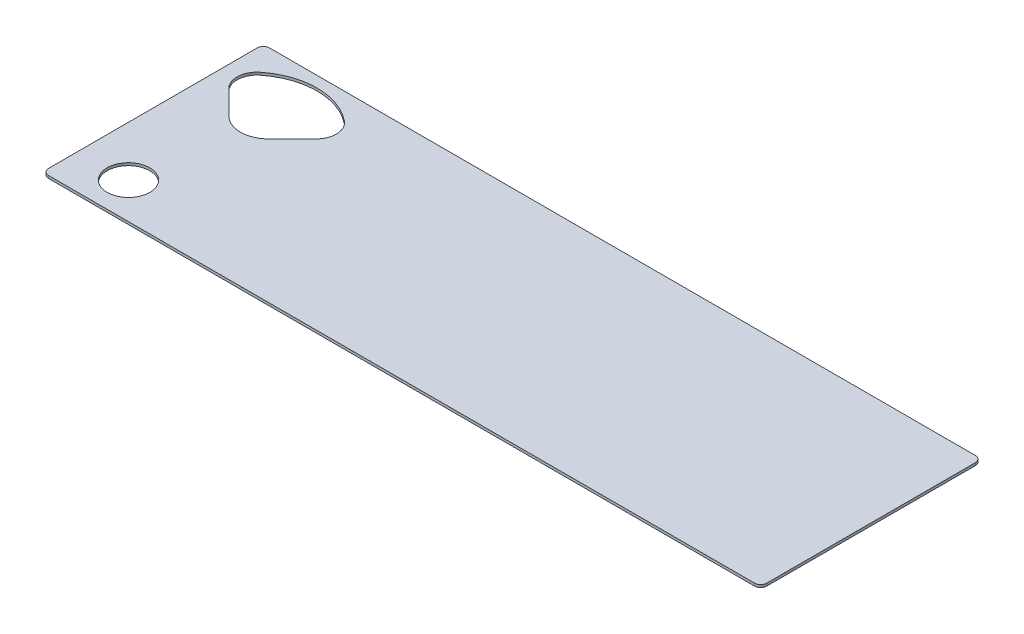
ISO-10303-21;
HEADER;
FILE_DESCRIPTION(('STEP AP214'),'2;1');
FILE_NAME('part.step','',(''),(''),'','','');
FILE_SCHEMA(('AUTOMOTIVE_DESIGN { 1 0 10303 214 1 1 1 1 }'));
ENDSEC;
DATA;
#1=APPLICATION_CONTEXT('core data for automotive mechanical design processes');
#2=APPLICATION_PROTOCOL_DEFINITION('international standard','automotive_design',2000,#1);
#3=PRODUCT_CONTEXT('',#1,'mechanical');
#4=PRODUCT('Part','Part','',(#3));
#5=PRODUCT_RELATED_PRODUCT_CATEGORY('part','',(#4));
#6=PRODUCT_DEFINITION_FORMATION('','',#4);
#7=PRODUCT_DEFINITION_CONTEXT('part definition',#1,'design');
#8=PRODUCT_DEFINITION('design','',#6,#7);
#9=PRODUCT_DEFINITION_SHAPE('','',#8);
#10=(LENGTH_UNIT() NAMED_UNIT(*) SI_UNIT(.MILLI.,.METRE.));
#11=(NAMED_UNIT(*) PLANE_ANGLE_UNIT() SI_UNIT($,.RADIAN.));
#12=(NAMED_UNIT(*) SI_UNIT($,.STERADIAN.) SOLID_ANGLE_UNIT());
#13=UNCERTAINTY_MEASURE_WITH_UNIT(LENGTH_MEASURE(1.E-05),#10,'distance_accuracy_value','');
#14=(GEOMETRIC_REPRESENTATION_CONTEXT(3) GLOBAL_UNCERTAINTY_ASSIGNED_CONTEXT((#13)) GLOBAL_UNIT_ASSIGNED_CONTEXT((#10,
#11,#12)) REPRESENTATION_CONTEXT('',''));
#15=CARTESIAN_POINT('',(0.,0.,0.));
#16=DIRECTION('',(0.,0.,1.));
#17=DIRECTION('',(1.,0.,0.));
#18=AXIS2_PLACEMENT_3D('',#15,#16,#17);
#19=CARTESIAN_POINT('',(-861.466870604861,6.35,254.406870604861));
#20=DIRECTION('',(0.,1.,0.));
#21=DIRECTION('',(-0.707106781186549,0.,0.707106781186546));
#22=AXIS2_PLACEMENT_3D('',#19,#20,#21);
#23=ELLIPSE('',#22,15.4680526775653,15.2400000000001);
#24=DIRECTION('',(0.,-1.,0.));
#25=VECTOR('',#24,1.);
#26=SURFACE_OF_LINEAR_EXTRUSION('',#23,#25);
#27=CARTESIAN_POINT('',(-861.466870604861,0.,254.406870604861));
#28=DIRECTION('',(0.,1.,0.));
#29=DIRECTION('',(-0.707106781186549,0.,0.707106781186546));
#30=AXIS2_PLACEMENT_3D('',#27,#28,#29);
#31=ELLIPSE('',#30,15.4680526775653,15.2400000000001);
#32=CARTESIAN_POINT('',(-876.821320344854,0.,254.63491699384));
#33=VERTEX_POINT('',#32);
#34=CARTESIAN_POINT('',(-861.69491699384,0.,269.761320344854));
#35=VERTEX_POINT('',#34);
#36=EDGE_CURVE('E182',#33,#35,#31,.T.);
#37=ORIENTED_EDGE('',*,*,#36,.T.);
#38=DIRECTION('',(0.,-1.,0.));
#39=VECTOR('',#38,1.);
#40=CARTESIAN_POINT('',(-861.69491699384,6.35,269.761320344854));
#41=LINE('',#40,#39);
#42=CARTESIAN_POINT('',(-861.69491699384,6.35,269.761320344854));
#43=VERTEX_POINT('',#42);
#44=EDGE_CURVE('E11',#43,#35,#41,.T.);
#45=ORIENTED_EDGE('',*,*,#44,.F.);
#46=CARTESIAN_POINT('',(-876.821320344854,6.35,254.63491699384));
#47=VERTEX_POINT('',#46);
#48=EDGE_CURVE('E189',#47,#43,#23,.T.);
#49=ORIENTED_EDGE('',*,*,#48,.F.);
#50=DIRECTION('',(0.,-1.,0.));
#51=VECTOR('',#50,1.);
#52=CARTESIAN_POINT('',(-876.821320344854,6.35,254.63491699384));
#53=LINE('',#52,#51);
#54=EDGE_CURVE('E242',#47,#33,#53,.T.);
#55=ORIENTED_EDGE('',*,*,#54,.T.);
#56=EDGE_LOOP('',(#37,#45,#49,#55));
#57=FACE_BOUND('',#56,.T.);
#58=ADVANCED_FACE('F32',(#57),#26,.F.);
#59=CARTESIAN_POINT('',(-861.69491699384,6.35,269.761320344854));
#60=DIRECTION('',(0.,0.,-1.));
#61=DIRECTION('',(-1.,0.,0.));
#62=AXIS2_PLACEMENT_3D('',#59,#60,#61);
#63=PLANE('',#62);
#64=DIRECTION('',(1.,0.,0.));
#65=VECTOR('',#64,1.);
#66=CARTESIAN_POINT('',(-861.69491699384,0.,269.761320344854));
#67=LINE('',#66,#65);
#68=CARTESIAN_POINT('',(861.69491699384,0.,269.761320344854));
#69=VERTEX_POINT('',#68);
#70=EDGE_CURVE('E216',#35,#69,#67,.T.);
#71=ORIENTED_EDGE('',*,*,#70,.T.);
#72=DIRECTION('',(0.,-1.,0.));
#73=VECTOR('',#72,1.);
#74=CARTESIAN_POINT('',(861.69491699384,6.35,269.761320344854));
#75=LINE('',#74,#73);
#76=CARTESIAN_POINT('',(861.69491699384,6.35,269.761320344854));
#77=VERTEX_POINT('',#76);
#78=EDGE_CURVE('E40',#77,#69,#75,.T.);
#79=ORIENTED_EDGE('',*,*,#78,.F.);
#80=DIRECTION('',(1.,0.,0.));
#81=VECTOR('',#80,1.);
#82=CARTESIAN_POINT('',(-861.69491699384,6.35,269.761320344854));
#83=LINE('',#82,#81);
#84=EDGE_CURVE('E193',#43,#77,#83,.T.);
#85=ORIENTED_EDGE('',*,*,#84,.F.);
#86=ORIENTED_EDGE('',*,*,#44,.T.);
#87=EDGE_LOOP('',(#71,#79,#85,#86));
#88=FACE_BOUND('',#87,.T.);
#89=ADVANCED_FACE('F206',(#88),#63,.F.);
#90=CARTESIAN_POINT('',(861.466870604861,6.35,254.406870604861));
#91=DIRECTION('',(0.,1.,0.));
#92=DIRECTION('',(0.707106781186549,0.,0.707106781186546));
#93=AXIS2_PLACEMENT_3D('',#90,#91,#92);
#94=ELLIPSE('',#93,15.4680526775653,15.24);
#95=DIRECTION('',(0.,-1.,0.));
#96=VECTOR('',#95,1.);
#97=SURFACE_OF_LINEAR_EXTRUSION('',#94,#96);
#98=CARTESIAN_POINT('',(861.466870604861,0.,254.406870604861));
#99=DIRECTION('',(0.,1.,0.));
#100=DIRECTION('',(0.707106781186549,0.,0.707106781186546));
#101=AXIS2_PLACEMENT_3D('',#98,#99,#100);
#102=ELLIPSE('',#101,15.4680526775653,15.24);
#103=CARTESIAN_POINT('',(876.821320344854,0.,254.63491699384));
#104=VERTEX_POINT('',#103);
#105=EDGE_CURVE('E223',#69,#104,#102,.T.);
#106=ORIENTED_EDGE('',*,*,#105,.T.);
#107=DIRECTION('',(0.,-1.,0.));
#108=VECTOR('',#107,1.);
#109=CARTESIAN_POINT('',(876.821320344854,6.35,254.63491699384));
#110=LINE('',#109,#108);
#111=CARTESIAN_POINT('',(876.821320344854,6.35,254.63491699384));
#112=VERTEX_POINT('',#111);
#113=EDGE_CURVE('E227',#112,#104,#110,.T.);
#114=ORIENTED_EDGE('',*,*,#113,.F.);
#115=EDGE_CURVE('E196',#77,#112,#94,.T.);
#116=ORIENTED_EDGE('',*,*,#115,.F.);
#117=ORIENTED_EDGE('',*,*,#78,.T.);
#118=EDGE_LOOP('',(#106,#114,#116,#117));
#119=FACE_BOUND('',#118,.T.);
#120=ADVANCED_FACE('F202',(#119),#97,.F.);
#121=CARTESIAN_POINT('',(876.821320344854,6.35,254.63491699384));
#122=DIRECTION('',(-1.,0.,0.));
#123=DIRECTION('',(0.,0.,1.));
#124=AXIS2_PLACEMENT_3D('',#121,#122,#123);
#125=PLANE('',#124);
#126=DIRECTION('',(0.,0.,-1.));
#127=VECTOR('',#126,1.);
#128=CARTESIAN_POINT('',(876.821320344854,0.,254.63491699384));
#129=LINE('',#128,#127);
#130=CARTESIAN_POINT('',(876.821320344854,0.,-254.63491699384));
#131=VERTEX_POINT('',#130);
#132=EDGE_CURVE('E230',#104,#131,#129,.T.);
#133=ORIENTED_EDGE('',*,*,#132,.T.);
#134=DIRECTION('',(0.,-1.,0.));
#135=VECTOR('',#134,1.);
#136=CARTESIAN_POINT('',(876.821320344854,6.35,-254.63491699384));
#137=LINE('',#136,#135);
#138=CARTESIAN_POINT('',(876.821320344854,6.35,-254.63491699384));
#139=VERTEX_POINT('',#138);
#140=EDGE_CURVE('E255',#139,#131,#137,.T.);
#141=ORIENTED_EDGE('',*,*,#140,.F.);
#142=DIRECTION('',(0.,0.,-1.));
#143=VECTOR('',#142,1.);
#144=CARTESIAN_POINT('',(876.821320344854,6.35,254.63491699384));
#145=LINE('',#144,#143);
#146=EDGE_CURVE('E199',#112,#139,#145,.T.);
#147=ORIENTED_EDGE('',*,*,#146,.F.);
#148=ORIENTED_EDGE('',*,*,#113,.T.);
#149=EDGE_LOOP('',(#133,#141,#147,#148));
#150=FACE_BOUND('',#149,.T.);
#151=ADVANCED_FACE('F205',(#150),#125,.F.);
#152=CARTESIAN_POINT('',(861.466870604861,6.35,-254.406870604861));
#153=DIRECTION('',(0.,1.,0.));
#154=DIRECTION('',(0.707106781186549,0.,-0.707106781186546));
#155=AXIS2_PLACEMENT_3D('',#152,#153,#154);
#156=ELLIPSE('',#155,15.4680526775653,15.2400000000001);
#157=DIRECTION('',(0.,-1.,0.));
#158=VECTOR('',#157,1.);
#159=SURFACE_OF_LINEAR_EXTRUSION('',#156,#158);
#160=CARTESIAN_POINT('',(861.466870604861,0.,-254.406870604861));
#161=DIRECTION('',(0.,1.,0.));
#162=DIRECTION('',(0.707106781186549,0.,-0.707106781186546));
#163=AXIS2_PLACEMENT_3D('',#160,#161,#162);
#164=ELLIPSE('',#163,15.4680526775653,15.2400000000001);
#165=CARTESIAN_POINT('',(861.69491699384,0.,-269.761320344854));
#166=VERTEX_POINT('',#165);
#167=EDGE_CURVE('E232',#131,#166,#164,.T.);
#168=ORIENTED_EDGE('',*,*,#167,.T.);
#169=DIRECTION('',(0.,-1.,0.));
#170=VECTOR('',#169,1.);
#171=CARTESIAN_POINT('',(861.69491699384,6.35,-269.761320344854));
#172=LINE('',#171,#170);
#173=CARTESIAN_POINT('',(861.69491699384,6.35,-269.761320344854));
#174=VERTEX_POINT('',#173);
#175=EDGE_CURVE('E252',#174,#166,#172,.T.);
#176=ORIENTED_EDGE('',*,*,#175,.F.);
#177=EDGE_CURVE('E263',#139,#174,#156,.T.);
#178=ORIENTED_EDGE('',*,*,#177,.F.);
#179=ORIENTED_EDGE('',*,*,#140,.T.);
#180=EDGE_LOOP('',(#168,#176,#178,#179));
#181=FACE_BOUND('',#180,.T.);
#182=ADVANCED_FACE('F270',(#181),#159,.F.);
#183=CARTESIAN_POINT('',(861.69491699384,6.35,-269.761320344854));
#184=DIRECTION('',(0.,0.,1.));
#185=DIRECTION('',(1.,0.,0.));
#186=AXIS2_PLACEMENT_3D('',#183,#184,#185);
#187=PLANE('',#186);
#188=DIRECTION('',(-1.,0.,0.));
#189=VECTOR('',#188,1.);
#190=CARTESIAN_POINT('',(861.69491699384,0.,-269.761320344854));
#191=LINE('',#190,#189);
#192=CARTESIAN_POINT('',(-861.69491699384,0.,-269.761320344854));
#193=VERTEX_POINT('',#192);
#194=EDGE_CURVE('E237',#166,#193,#191,.T.);
#195=ORIENTED_EDGE('',*,*,#194,.T.);
#196=DIRECTION('',(0.,-1.,0.));
#197=VECTOR('',#196,1.);
#198=CARTESIAN_POINT('',(-861.69491699384,6.35,-269.761320344854));
#199=LINE('',#198,#197);
#200=CARTESIAN_POINT('',(-861.69491699384,6.35,-269.761320344854));
#201=VERTEX_POINT('',#200);
#202=EDGE_CURVE('E249',#201,#193,#199,.T.);
#203=ORIENTED_EDGE('',*,*,#202,.F.);
#204=DIRECTION('',(-1.,0.,0.));
#205=VECTOR('',#204,1.);
#206=CARTESIAN_POINT('',(861.69491699384,6.35,-269.761320344854));
#207=LINE('',#206,#205);
#208=EDGE_CURVE('E264',#174,#201,#207,.T.);
#209=ORIENTED_EDGE('',*,*,#208,.F.);
#210=ORIENTED_EDGE('',*,*,#175,.T.);
#211=EDGE_LOOP('',(#195,#203,#209,#210));
#212=FACE_BOUND('',#211,.T.);
#213=ADVANCED_FACE('F273',(#212),#187,.F.);
#214=CARTESIAN_POINT('',(-861.466870604861,6.35,-254.406870604861));
#215=DIRECTION('',(0.,1.,0.));
#216=DIRECTION('',(-0.707106781186549,0.,-0.707106781186546));
#217=AXIS2_PLACEMENT_3D('',#214,#215,#216);
#218=ELLIPSE('',#217,15.4680526775653,15.24);
#219=DIRECTION('',(0.,-1.,0.));
#220=VECTOR('',#219,1.);
#221=SURFACE_OF_LINEAR_EXTRUSION('',#218,#220);
#222=CARTESIAN_POINT('',(-861.466870604861,0.,-254.406870604861));
#223=DIRECTION('',(0.,1.,0.));
#224=DIRECTION('',(-0.707106781186549,0.,-0.707106781186546));
#225=AXIS2_PLACEMENT_3D('',#222,#223,#224);
#226=ELLIPSE('',#225,15.4680526775653,15.24);
#227=CARTESIAN_POINT('',(-876.821320344854,0.,-254.63491699384));
#228=VERTEX_POINT('',#227);
#229=EDGE_CURVE('E239',#193,#228,#226,.T.);
#230=ORIENTED_EDGE('',*,*,#229,.T.);
#231=DIRECTION('',(0.,-1.,0.));
#232=VECTOR('',#231,1.);
#233=CARTESIAN_POINT('',(-876.821320344854,6.35,-254.63491699384));
#234=LINE('',#233,#232);
#235=CARTESIAN_POINT('',(-876.821320344854,6.35,-254.63491699384));
#236=VERTEX_POINT('',#235);
#237=EDGE_CURVE('E245',#236,#228,#234,.T.);
#238=ORIENTED_EDGE('',*,*,#237,.F.);
#239=EDGE_CURVE('E266',#201,#236,#218,.T.);
#240=ORIENTED_EDGE('',*,*,#239,.F.);
#241=ORIENTED_EDGE('',*,*,#202,.T.);
#242=EDGE_LOOP('',(#230,#238,#240,#241));
#243=FACE_BOUND('',#242,.T.);
#244=ADVANCED_FACE('F277',(#243),#221,.F.);
#245=CARTESIAN_POINT('',(-876.821320344854,6.35,-254.63491699384));
#246=DIRECTION('',(1.,0.,0.));
#247=DIRECTION('',(0.,0.,-1.));
#248=AXIS2_PLACEMENT_3D('',#245,#246,#247);
#249=PLANE('',#248);
#250=DIRECTION('',(0.,0.,1.));
#251=VECTOR('',#250,1.);
#252=CARTESIAN_POINT('',(-876.821320344854,0.,-254.63491699384));
#253=LINE('',#252,#251);
#254=EDGE_CURVE('E194',#228,#33,#253,.T.);
#255=ORIENTED_EDGE('',*,*,#254,.T.);
#256=ORIENTED_EDGE('',*,*,#54,.F.);
#257=DIRECTION('',(0.,0.,1.));
#258=VECTOR('',#257,1.);
#259=CARTESIAN_POINT('',(-876.821320344854,6.35,-254.63491699384));
#260=LINE('',#259,#258);
#261=EDGE_CURVE('E246',#236,#47,#260,.T.);
#262=ORIENTED_EDGE('',*,*,#261,.F.);
#263=ORIENTED_EDGE('',*,*,#237,.T.);
#264=EDGE_LOOP('',(#255,#256,#262,#263));
#265=FACE_BOUND('',#264,.T.);
#266=ADVANCED_FACE('F281',(#265),#249,.F.);
#267=CARTESIAN_POINT('',(-861.466870604861,6.35,254.406870604861));
#268=DIRECTION('',(0.,1.,0.));
#269=DIRECTION('',(0.,0.,1.));
#270=AXIS2_PLACEMENT_3D('',#267,#268,#269);
#271=PLANE('',#270);
#272=CARTESIAN_POINT('',(-754.50638834792,6.35,181.844577047281));
#273=DIRECTION('',(0.,1.,0.));
#274=DIRECTION('',(0.,0.,1.));
#275=AXIS2_PLACEMENT_3D('',#272,#273,#274);
#276=CIRCLE('',#275,52.0700000000001);
#277=CARTESIAN_POINT('',(-754.50638834792,6.35,233.914577047281));
#278=VERTEX_POINT('',#277);
#279=EDGE_CURVE('E158',#278,#278,#276,.T.);
#280=ORIENTED_EDGE('',*,*,#279,.F.);
#281=EDGE_LOOP('',(#280));
#282=FACE_BOUND('',#281,.T.);
#283=CARTESIAN_POINT('',(-719.067867535307,6.35,-124.701940777126));
#284=DIRECTION('',(0.,1.,0.));
#285=DIRECTION('',(0.,0.,1.));
#286=AXIS2_PLACEMENT_3D('',#283,#284,#285);
#287=CIRCLE('',#286,68.5871863601399);
#288=CARTESIAN_POINT('',(-767.566332113067,6.35,-76.2034761993652));
#289=VERTEX_POINT('',#288);
#290=CARTESIAN_POINT('',(-670.569402957547,6.35,-76.203476199365));
#291=VERTEX_POINT('',#290);
#292=EDGE_CURVE('E47',#289,#291,#287,.T.);
#293=ORIENTED_EDGE('',*,*,#292,.F.);
#294=DIRECTION('',(0.707106781186549,0.,0.707106781186546));
#295=VECTOR('',#294,1.);
#296=CARTESIAN_POINT('',(-825.954313112611,6.35,-134.591457198908));
#297=LINE('',#296,#295);
#298=CARTESIAN_POINT('',(-825.954313112611,6.35,-134.591457198908));
#299=VERTEX_POINT('',#298);
#300=EDGE_CURVE('E152',#299,#289,#297,.T.);
#301=ORIENTED_EDGE('',*,*,#300,.F.);
#302=CARTESIAN_POINT('',(-791.597984158582,6.35,-168.947786152938));
#303=DIRECTION('',(0.,1.,0.));
#304=DIRECTION('',(0.,0.,1.));
#305=AXIS2_PLACEMENT_3D('',#302,#303,#304);
#306=CIRCLE('',#305,48.5871863601399);
#307=CARTESIAN_POINT('',(-822.043204833292,6.35,-206.813380251845));
#308=VERTEX_POINT('',#307);
#309=EDGE_CURVE('E155',#308,#299,#306,.T.);
#310=ORIENTED_EDGE('',*,*,#309,.F.);
#311=CARTESIAN_POINT('',(-719.067867535307,6.35,-78.74));
#312=DIRECTION('',(0.,1.,0.));
#313=DIRECTION('',(0.,0.,1.));
#314=AXIS2_PLACEMENT_3D('',#311,#312,#313);
#315=CIRCLE('',#314,164.33718636014);
#316=CARTESIAN_POINT('',(-616.092530237323,6.35,-206.813380251845));
#317=VERTEX_POINT('',#316);
#318=EDGE_CURVE('E175',#317,#308,#315,.T.);
#319=ORIENTED_EDGE('',*,*,#318,.F.);
#320=CARTESIAN_POINT('',(-646.537750912032,6.35,-168.947786152938));
#321=DIRECTION('',(0.,1.,0.));
#322=DIRECTION('',(0.,0.,1.));
#323=AXIS2_PLACEMENT_3D('',#320,#321,#322);
#324=CIRCLE('',#323,48.5871863601399);
#325=CARTESIAN_POINT('',(-612.181421958003,6.35,-134.591457198909));
#326=VERTEX_POINT('',#325);
#327=EDGE_CURVE('E172',#326,#317,#324,.T.);
#328=ORIENTED_EDGE('',*,*,#327,.F.);
#329=DIRECTION('',(0.707106781186549,0.,-0.707106781186546));
#330=VECTOR('',#329,1.);
#331=CARTESIAN_POINT('',(-670.569402957547,6.35,-76.203476199365));
#332=LINE('',#331,#330);
#333=EDGE_CURVE('E169',#291,#326,#332,.T.);
#334=ORIENTED_EDGE('',*,*,#333,.F.);
#335=EDGE_LOOP('',(#293,#301,#310,#319,#328,#334));
#336=FACE_BOUND('',#335,.T.);
#337=ORIENTED_EDGE('',*,*,#48,.T.);
#338=ORIENTED_EDGE('',*,*,#84,.T.);
#339=ORIENTED_EDGE('',*,*,#115,.T.);
#340=ORIENTED_EDGE('',*,*,#146,.T.);
#341=ORIENTED_EDGE('',*,*,#177,.T.);
#342=ORIENTED_EDGE('',*,*,#208,.T.);
#343=ORIENTED_EDGE('',*,*,#239,.T.);
#344=ORIENTED_EDGE('',*,*,#261,.T.);
#345=EDGE_LOOP('',(#337,#338,#339,#340,#341,#342,#343,#344));
#346=FACE_BOUND('',#345,.T.);
#347=ADVANCED_FACE('F297',(#282,#336,#346),#271,.T.);
#348=CARTESIAN_POINT('',(-861.466870604861,0.,254.406870604861));
#349=DIRECTION('',(0.,1.,0.));
#350=DIRECTION('',(0.,0.,1.));
#351=AXIS2_PLACEMENT_3D('',#348,#349,#350);
#352=PLANE('',#351);
#353=CARTESIAN_POINT('',(-754.50638834792,0.,181.844577047281));
#354=DIRECTION('',(0.,1.,0.));
#355=DIRECTION('',(0.,0.,1.));
#356=AXIS2_PLACEMENT_3D('',#353,#354,#355);
#357=CIRCLE('',#356,52.0700000000001);
#358=CARTESIAN_POINT('',(-754.50638834792,0.,233.914577047281));
#359=VERTEX_POINT('',#358);
#360=EDGE_CURVE('E170',#359,#359,#357,.T.);
#361=ORIENTED_EDGE('',*,*,#360,.T.);
#362=EDGE_LOOP('',(#361));
#363=FACE_BOUND('',#362,.T.);
#364=DIRECTION('',(0.707106781186549,0.,0.707106781186546));
#365=VECTOR('',#364,1.);
#366=CARTESIAN_POINT('',(-825.954313112611,0.,-134.591457198908));
#367=LINE('',#366,#365);
#368=CARTESIAN_POINT('',(-825.954313112611,0.,-134.591457198908));
#369=VERTEX_POINT('',#368);
#370=CARTESIAN_POINT('',(-767.566332113067,0.,-76.2034761993652));
#371=VERTEX_POINT('',#370);
#372=EDGE_CURVE('E141',#369,#371,#367,.T.);
#373=ORIENTED_EDGE('',*,*,#372,.T.);
#374=CARTESIAN_POINT('',(-719.067867535307,0.,-124.701940777126));
#375=DIRECTION('',(0.,1.,0.));
#376=DIRECTION('',(0.,0.,1.));
#377=AXIS2_PLACEMENT_3D('',#374,#375,#376);
#378=CIRCLE('',#377,68.5871863601399);
#379=CARTESIAN_POINT('',(-670.569402957547,0.,-76.203476199365));
#380=VERTEX_POINT('',#379);
#381=EDGE_CURVE('E135',#371,#380,#378,.T.);
#382=ORIENTED_EDGE('',*,*,#381,.T.);
#383=DIRECTION('',(0.707106781186549,0.,-0.707106781186546));
#384=VECTOR('',#383,1.);
#385=CARTESIAN_POINT('',(-670.569402957547,0.,-76.203476199365));
#386=LINE('',#385,#384);
#387=CARTESIAN_POINT('',(-612.181421958003,0.,-134.591457198909));
#388=VERTEX_POINT('',#387);
#389=EDGE_CURVE('E144',#380,#388,#386,.T.);
#390=ORIENTED_EDGE('',*,*,#389,.T.);
#391=CARTESIAN_POINT('',(-646.537750912032,0.,-168.947786152938));
#392=DIRECTION('',(0.,1.,0.));
#393=DIRECTION('',(0.,0.,1.));
#394=AXIS2_PLACEMENT_3D('',#391,#392,#393);
#395=CIRCLE('',#394,48.5871863601399);
#396=CARTESIAN_POINT('',(-616.092530237323,0.,-206.813380251845));
#397=VERTEX_POINT('',#396);
#398=EDGE_CURVE('E55',#388,#397,#395,.T.);
#399=ORIENTED_EDGE('',*,*,#398,.T.);
#400=CARTESIAN_POINT('',(-719.067867535307,0.,-78.74));
#401=DIRECTION('',(0.,1.,0.));
#402=DIRECTION('',(0.,0.,1.));
#403=AXIS2_PLACEMENT_3D('',#400,#401,#402);
#404=CIRCLE('',#403,164.33718636014);
#405=CARTESIAN_POINT('',(-822.043204833292,0.,-206.813380251845));
#406=VERTEX_POINT('',#405);
#407=EDGE_CURVE('E162',#397,#406,#404,.T.);
#408=ORIENTED_EDGE('',*,*,#407,.T.);
#409=CARTESIAN_POINT('',(-791.597984158582,0.,-168.947786152938));
#410=DIRECTION('',(0.,1.,0.));
#411=DIRECTION('',(0.,0.,1.));
#412=AXIS2_PLACEMENT_3D('',#409,#410,#411);
#413=CIRCLE('',#412,48.5871863601399);
#414=EDGE_CURVE('E165',#406,#369,#413,.T.);
#415=ORIENTED_EDGE('',*,*,#414,.T.);
#416=EDGE_LOOP('',(#373,#382,#390,#399,#408,#415));
#417=FACE_BOUND('',#416,.T.);
#418=ORIENTED_EDGE('',*,*,#36,.F.);
#419=ORIENTED_EDGE('',*,*,#254,.F.);
#420=ORIENTED_EDGE('',*,*,#229,.F.);
#421=ORIENTED_EDGE('',*,*,#194,.F.);
#422=ORIENTED_EDGE('',*,*,#167,.F.);
#423=ORIENTED_EDGE('',*,*,#132,.F.);
#424=ORIENTED_EDGE('',*,*,#105,.F.);
#425=ORIENTED_EDGE('',*,*,#70,.F.);
#426=EDGE_LOOP('',(#418,#419,#420,#421,#422,#423,#424,#425));
#427=FACE_BOUND('',#426,.T.);
#428=ADVANCED_FACE('F148',(#363,#417,#427),#352,.F.);
#429=CARTESIAN_POINT('',(-719.067867535307,0.,-124.701940777126));
#430=DIRECTION('',(0.,1.,0.));
#431=DIRECTION('',(0.,0.,1.));
#432=AXIS2_PLACEMENT_3D('',#429,#430,#431);
#433=CYLINDRICAL_SURFACE('',#432,68.5871863601399);
#434=ORIENTED_EDGE('',*,*,#292,.T.);
#435=DIRECTION('',(0.,1.,0.));
#436=VECTOR('',#435,1.);
#437=CARTESIAN_POINT('',(-670.569402957547,0.,-76.203476199365));
#438=LINE('',#437,#436);
#439=EDGE_CURVE('E131',#380,#291,#438,.T.);
#440=ORIENTED_EDGE('',*,*,#439,.F.);
#441=ORIENTED_EDGE('',*,*,#381,.F.);
#442=DIRECTION('',(0.,1.,0.));
#443=VECTOR('',#442,1.);
#444=CARTESIAN_POINT('',(-767.566332113067,0.,-76.2034761993652));
#445=LINE('',#444,#443);
#446=EDGE_CURVE('E180',#371,#289,#445,.T.);
#447=ORIENTED_EDGE('',*,*,#446,.T.);
#448=EDGE_LOOP('',(#434,#440,#441,#447));
#449=FACE_BOUND('',#448,.T.);
#450=ADVANCED_FACE('F133',(#449),#433,.F.);
#451=CARTESIAN_POINT('',(-825.954313112611,0.,-134.591457198908));
#452=DIRECTION('',(-0.707106781186546,0.,0.707106781186549));
#453=DIRECTION('',(0.707106781186549,0.,0.707106781186546));
#454=AXIS2_PLACEMENT_3D('',#451,#452,#453);
#455=PLANE('',#454);
#456=ORIENTED_EDGE('',*,*,#300,.T.);
#457=ORIENTED_EDGE('',*,*,#446,.F.);
#458=ORIENTED_EDGE('',*,*,#372,.F.);
#459=DIRECTION('',(0.,1.,0.));
#460=VECTOR('',#459,1.);
#461=CARTESIAN_POINT('',(-825.954313112611,0.,-134.591457198908));
#462=LINE('',#461,#460);
#463=EDGE_CURVE('E183',#369,#299,#462,.T.);
#464=ORIENTED_EDGE('',*,*,#463,.T.);
#465=EDGE_LOOP('',(#456,#457,#458,#464));
#466=FACE_BOUND('',#465,.T.);
#467=ADVANCED_FACE('F311',(#466),#455,.F.);
#468=CARTESIAN_POINT('',(-791.597984158582,0.,-168.947786152938));
#469=DIRECTION('',(0.,1.,0.));
#470=DIRECTION('',(0.,0.,1.));
#471=AXIS2_PLACEMENT_3D('',#468,#469,#470);
#472=CYLINDRICAL_SURFACE('',#471,48.5871863601399);
#473=ORIENTED_EDGE('',*,*,#309,.T.);
#474=ORIENTED_EDGE('',*,*,#463,.F.);
#475=ORIENTED_EDGE('',*,*,#414,.F.);
#476=DIRECTION('',(0.,1.,0.));
#477=VECTOR('',#476,1.);
#478=CARTESIAN_POINT('',(-822.043204833292,0.,-206.813380251845));
#479=LINE('',#478,#477);
#480=EDGE_CURVE('E185',#406,#308,#479,.T.);
#481=ORIENTED_EDGE('',*,*,#480,.T.);
#482=EDGE_LOOP('',(#473,#474,#475,#481));
#483=FACE_BOUND('',#482,.T.);
#484=ADVANCED_FACE('F321',(#483),#472,.F.);
#485=CARTESIAN_POINT('',(-719.067867535307,0.,-78.74));
#486=DIRECTION('',(0.,1.,0.));
#487=DIRECTION('',(0.,0.,1.));
#488=AXIS2_PLACEMENT_3D('',#485,#486,#487);
#489=CYLINDRICAL_SURFACE('',#488,164.33718636014);
#490=ORIENTED_EDGE('',*,*,#318,.T.);
#491=ORIENTED_EDGE('',*,*,#480,.F.);
#492=ORIENTED_EDGE('',*,*,#407,.F.);
#493=DIRECTION('',(0.,1.,0.));
#494=VECTOR('',#493,1.);
#495=CARTESIAN_POINT('',(-616.092530237323,0.,-206.813380251845));
#496=LINE('',#495,#494);
#497=EDGE_CURVE('E187',#397,#317,#496,.T.);
#498=ORIENTED_EDGE('',*,*,#497,.T.);
#499=EDGE_LOOP('',(#490,#491,#492,#498));
#500=FACE_BOUND('',#499,.T.);
#501=ADVANCED_FACE('F318',(#500),#489,.F.);
#502=CARTESIAN_POINT('',(-646.537750912032,0.,-168.947786152938));
#503=DIRECTION('',(0.,1.,0.));
#504=DIRECTION('',(0.,0.,1.));
#505=AXIS2_PLACEMENT_3D('',#502,#503,#504);
#506=CYLINDRICAL_SURFACE('',#505,48.5871863601399);
#507=ORIENTED_EDGE('',*,*,#327,.T.);
#508=ORIENTED_EDGE('',*,*,#497,.F.);
#509=ORIENTED_EDGE('',*,*,#398,.F.);
#510=DIRECTION('',(0.,1.,0.));
#511=VECTOR('',#510,1.);
#512=CARTESIAN_POINT('',(-612.181421958003,0.,-134.591457198909));
#513=LINE('',#512,#511);
#514=EDGE_CURVE('E140',#388,#326,#513,.T.);
#515=ORIENTED_EDGE('',*,*,#514,.T.);
#516=EDGE_LOOP('',(#507,#508,#509,#515));
#517=FACE_BOUND('',#516,.T.);
#518=ADVANCED_FACE('F315',(#517),#506,.F.);
#519=CARTESIAN_POINT('',(-670.569402957547,0.,-76.203476199365));
#520=DIRECTION('',(0.707106781186546,0.,0.707106781186549));
#521=DIRECTION('',(0.707106781186549,0.,-0.707106781186546));
#522=AXIS2_PLACEMENT_3D('',#519,#520,#521);
#523=PLANE('',#522);
#524=ORIENTED_EDGE('',*,*,#333,.T.);
#525=ORIENTED_EDGE('',*,*,#514,.F.);
#526=ORIENTED_EDGE('',*,*,#389,.F.);
#527=ORIENTED_EDGE('',*,*,#439,.T.);
#528=EDGE_LOOP('',(#524,#525,#526,#527));
#529=FACE_BOUND('',#528,.T.);
#530=ADVANCED_FACE('F145',(#529),#523,.F.);
#531=CARTESIAN_POINT('',(-754.50638834792,0.,181.844577047281));
#532=DIRECTION('',(0.,1.,0.));
#533=DIRECTION('',(0.,0.,1.));
#534=AXIS2_PLACEMENT_3D('',#531,#532,#533);
#535=CYLINDRICAL_SURFACE('',#534,52.0700000000001);
#536=ORIENTED_EDGE('',*,*,#360,.F.);
#537=EDGE_LOOP('',(#536));
#538=FACE_BOUND('',#537,.T.);
#539=ORIENTED_EDGE('',*,*,#279,.T.);
#540=EDGE_LOOP('',(#539));
#541=FACE_BOUND('',#540,.T.);
#542=ADVANCED_FACE('F314',(#538,#541),#535,.F.);
#543=CLOSED_SHELL('',(#58,#89,#120,#151,#182,#213,#244,#266,#347,#428,#450,#467,#484,#501,#518,
#530,#542));
#544=MANIFOLD_SOLID_BREP('B2',#543);
#545=ADVANCED_BREP_SHAPE_REPRESENTATION('',(#18,#544),#14);
#546=SHAPE_DEFINITION_REPRESENTATION(#9,#545);
ENDSEC;
END-ISO-10303-21;
